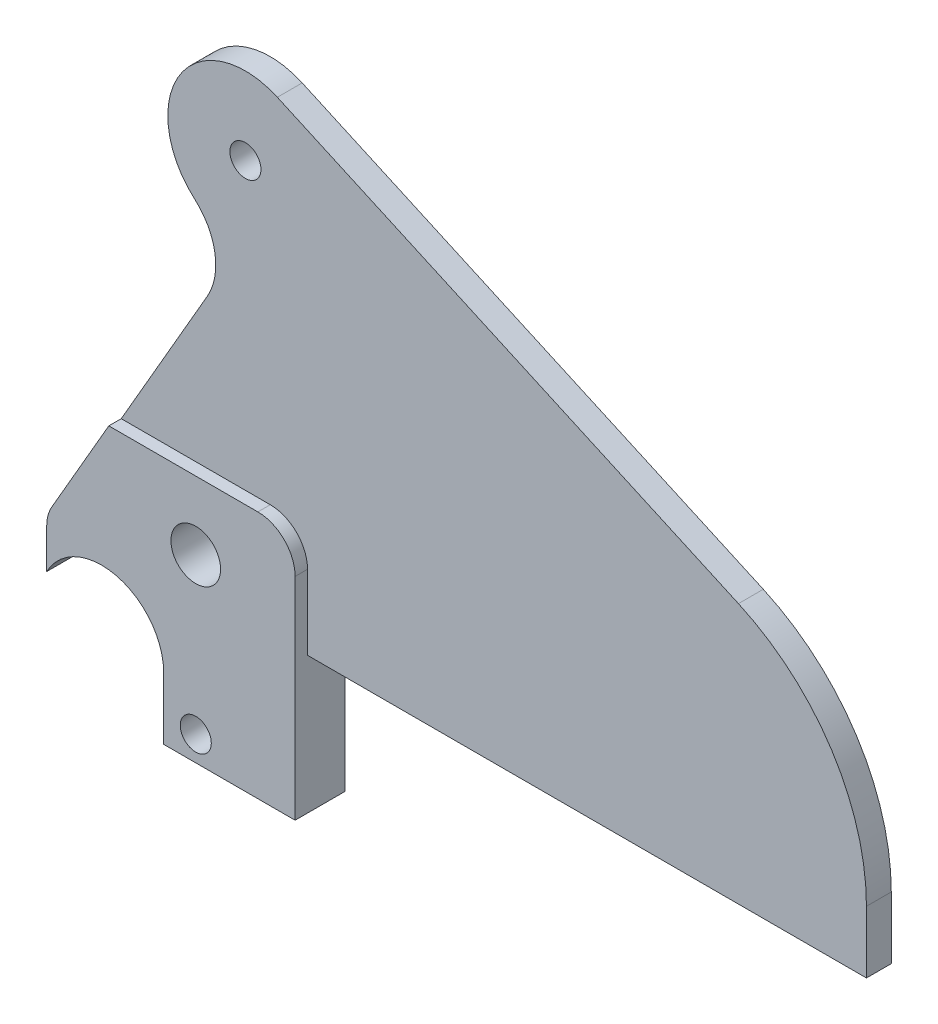
ISO-10303-21;
HEADER;
FILE_DESCRIPTION(('STEP AP214'),'2;1');
FILE_NAME('part.step','',(''),(''),'','','');
FILE_SCHEMA(('AUTOMOTIVE_DESIGN { 1 0 10303 214 1 1 1 1 }'));
ENDSEC;
DATA;
#1=APPLICATION_CONTEXT('core data for automotive mechanical design processes');
#2=APPLICATION_PROTOCOL_DEFINITION('international standard','automotive_design',2000,#1);
#3=PRODUCT_CONTEXT('',#1,'mechanical');
#4=PRODUCT('Part','Part','',(#3));
#5=PRODUCT_RELATED_PRODUCT_CATEGORY('part','',(#4));
#6=PRODUCT_DEFINITION_FORMATION('','',#4);
#7=PRODUCT_DEFINITION_CONTEXT('part definition',#1,'design');
#8=PRODUCT_DEFINITION('design','',#6,#7);
#9=PRODUCT_DEFINITION_SHAPE('','',#8);
#10=(LENGTH_UNIT() NAMED_UNIT(*) SI_UNIT(.MILLI.,.METRE.));
#11=(NAMED_UNIT(*) PLANE_ANGLE_UNIT() SI_UNIT($,.RADIAN.));
#12=(NAMED_UNIT(*) SI_UNIT($,.STERADIAN.) SOLID_ANGLE_UNIT());
#13=UNCERTAINTY_MEASURE_WITH_UNIT(LENGTH_MEASURE(1.E-05),#10,'distance_accuracy_value','');
#14=(GEOMETRIC_REPRESENTATION_CONTEXT(3) GLOBAL_UNCERTAINTY_ASSIGNED_CONTEXT((#13)) GLOBAL_UNIT_ASSIGNED_CONTEXT((#10,
#11,#12)) REPRESENTATION_CONTEXT('',''));
#15=CARTESIAN_POINT('',(0.,0.,0.));
#16=DIRECTION('',(0.,0.,1.));
#17=DIRECTION('',(1.,0.,0.));
#18=AXIS2_PLACEMENT_3D('',#15,#16,#17);
#19=CARTESIAN_POINT('',(0.,0.,1.));
#20=DIRECTION('',(0.,0.,1.));
#21=DIRECTION('',(1.,0.,0.));
#22=AXIS2_PLACEMENT_3D('',#19,#20,#21);
#23=PLANE('',#22);
#24=CARTESIAN_POINT('',(3.,41.,1.));
#25=DIRECTION('',(0.,0.,1.));
#26=DIRECTION('',(1.,0.,0.));
#27=AXIS2_PLACEMENT_3D('',#24,#25,#26);
#28=CIRCLE('',#27,1.25);
#29=CARTESIAN_POINT('',(4.25,41.,1.));
#30=VERTEX_POINT('',#29);
#31=EDGE_CURVE('E261',#30,#30,#28,.T.);
#32=ORIENTED_EDGE('',*,*,#31,.F.);
#33=EDGE_LOOP('',(#32));
#34=FACE_BOUND('',#33,.T.);
#35=DIRECTION('',(1.,0.,0.));
#36=VECTOR('',#35,1.);
#37=CARTESIAN_POINT('',(0.,18.,1.));
#38=LINE('',#37,#36);
#39=CARTESIAN_POINT('',(-7.00000000000003,18.,1.));
#40=VERTEX_POINT('',#39);
#41=CARTESIAN_POINT('',(5.,18.,1.));
#42=VERTEX_POINT('',#41);
#43=EDGE_CURVE('E238',#40,#42,#38,.T.);
#44=ORIENTED_EDGE('',*,*,#43,.T.);
#45=CARTESIAN_POINT('',(5.,15.,1.));
#46=DIRECTION('',(0.,0.,1.));
#47=DIRECTION('',(1.,0.,0.));
#48=AXIS2_PLACEMENT_3D('',#45,#46,#47);
#49=CIRCLE('',#48,3.);
#50=CARTESIAN_POINT('',(8.,15.,1.));
#51=VERTEX_POINT('',#50);
#52=EDGE_CURVE('E11',#42,#51,#49,.F.);
#53=ORIENTED_EDGE('',*,*,#52,.T.);
#54=DIRECTION('',(0.,-1.,0.));
#55=VECTOR('',#54,1.);
#56=CARTESIAN_POINT('',(8.,0.,1.));
#57=LINE('',#56,#55);
#58=CARTESIAN_POINT('',(8.,9.,1.));
#59=VERTEX_POINT('',#58);
#60=EDGE_CURVE('E241',#51,#59,#57,.T.);
#61=ORIENTED_EDGE('',*,*,#60,.T.);
#62=DIRECTION('',(1.,0.,0.));
#63=VECTOR('',#62,1.);
#64=CARTESIAN_POINT('',(0.,9.,1.));
#65=LINE('',#64,#63);
#66=CARTESIAN_POINT('',(53.,9.,1.));
#67=VERTEX_POINT('',#66);
#68=EDGE_CURVE('E244',#59,#67,#65,.T.);
#69=ORIENTED_EDGE('',*,*,#68,.T.);
#70=DIRECTION('',(0.,1.,0.));
#71=VECTOR('',#70,1.);
#72=CARTESIAN_POINT('',(53.,0.,1.));
#73=LINE('',#72,#71);
#74=CARTESIAN_POINT('',(53.,14.,1.));
#75=VERTEX_POINT('',#74);
#76=EDGE_CURVE('E246',#67,#75,#73,.T.);
#77=ORIENTED_EDGE('',*,*,#76,.T.);
#78=CARTESIAN_POINT('',(35.5,14.,1.));
#79=DIRECTION('',(0.,0.,1.));
#80=DIRECTION('',(1.,0.,0.));
#81=AXIS2_PLACEMENT_3D('',#78,#79,#80);
#82=CIRCLE('',#81,17.5);
#83=CARTESIAN_POINT('',(42.695106585047,29.9524431116307,1.));
#84=VERTEX_POINT('',#83);
#85=EDGE_CURVE('E249',#75,#84,#82,.T.);
#86=ORIENTED_EDGE('',*,*,#85,.T.);
#87=DIRECTION('',(0.911568177807467,-0.411148947716973,0.));
#88=VECTOR('',#87,1.);
#89=CARTESIAN_POINT('',(18.4432134750479,40.8908902569704,1.));
#90=LINE('',#89,#88);
#91=CARTESIAN_POINT('',(5.56968092323107,46.6973011112967,1.));
#92=VERTEX_POINT('',#91);
#93=EDGE_CURVE('E251',#92,#84,#90,.T.);
#94=ORIENTED_EDGE('',*,*,#93,.F.);
#95=CARTESIAN_POINT('',(3.,41.,1.));
#96=DIRECTION('',(0.,0.,1.));
#97=DIRECTION('',(1.,0.,0.));
#98=AXIS2_PLACEMENT_3D('',#95,#96,#97);
#99=CIRCLE('',#98,6.24999999999999);
#100=CARTESIAN_POINT('',(-1.10619804468567,36.288138624936,1.));
#101=VERTEX_POINT('',#100);
#102=EDGE_CURVE('E254',#92,#101,#99,.T.);
#103=ORIENTED_EDGE('',*,*,#102,.T.);
#104=CARTESIAN_POINT('',(-4.3911564804342,32.5186495248849,1.));
#105=DIRECTION('',(0.,0.,1.));
#106=DIRECTION('',(1.,0.,0.));
#107=AXIS2_PLACEMENT_3D('',#104,#105,#106);
#108=CIRCLE('',#107,5.);
#109=CARTESIAN_POINT('',(-0.0610294615120115,30.0186495248849,1.));
#110=VERTEX_POINT('',#109);
#111=EDGE_CURVE('E256',#110,#101,#108,.T.);
#112=ORIENTED_EDGE('',*,*,#111,.F.);
#113=DIRECTION('',(-0.499999999999998,-0.86602540378444,0.));
#114=VECTOR('',#113,1.);
#115=CARTESIAN_POINT('',(-13.04422863406,7.53108891324549,1.));
#116=LINE('',#115,#114);
#117=EDGE_CURVE('E259',#110,#40,#116,.T.);
#118=ORIENTED_EDGE('',*,*,#117,.T.);
#119=EDGE_LOOP('',(#44,#53,#61,#69,#77,#86,#94,#103,#112,#118));
#120=FACE_BOUND('',#119,.T.);
#121=ADVANCED_FACE('F39',(#34,#120),#23,.T.);
#122=CARTESIAN_POINT('',(0.,0.,-1.));
#123=DIRECTION('',(0.,0.,1.));
#124=DIRECTION('',(1.,0.,0.));
#125=AXIS2_PLACEMENT_3D('',#122,#123,#124);
#126=PLANE('',#125);
#127=CARTESIAN_POINT('',(3.,41.,-1.));
#128=DIRECTION('',(0.,0.,1.));
#129=DIRECTION('',(1.,0.,0.));
#130=AXIS2_PLACEMENT_3D('',#127,#128,#129);
#131=CIRCLE('',#130,1.25);
#132=CARTESIAN_POINT('',(4.25,41.,-1.));
#133=VERTEX_POINT('',#132);
#134=EDGE_CURVE('E247',#133,#133,#131,.T.);
#135=ORIENTED_EDGE('',*,*,#134,.T.);
#136=EDGE_LOOP('',(#135));
#137=FACE_BOUND('',#136,.T.);
#138=DIRECTION('',(0.,-1.,0.));
#139=VECTOR('',#138,1.);
#140=CARTESIAN_POINT('',(8.,0.,-1.));
#141=LINE('',#140,#139);
#142=CARTESIAN_POINT('',(8.,15.,-1.));
#143=VERTEX_POINT('',#142);
#144=CARTESIAN_POINT('',(8.,9.,-1.));
#145=VERTEX_POINT('',#144);
#146=EDGE_CURVE('E308',#143,#145,#141,.T.);
#147=ORIENTED_EDGE('',*,*,#146,.F.);
#148=CARTESIAN_POINT('',(5.,15.,-1.));
#149=DIRECTION('',(0.,0.,1.));
#150=DIRECTION('',(1.,0.,0.));
#151=AXIS2_PLACEMENT_3D('',#148,#149,#150);
#152=CIRCLE('',#151,3.);
#153=CARTESIAN_POINT('',(5.,18.,-1.));
#154=VERTEX_POINT('',#153);
#155=EDGE_CURVE('E47',#143,#154,#152,.T.);
#156=ORIENTED_EDGE('',*,*,#155,.T.);
#157=DIRECTION('',(1.,0.,0.));
#158=VECTOR('',#157,1.);
#159=CARTESIAN_POINT('',(0.,18.,-1.));
#160=LINE('',#159,#158);
#161=CARTESIAN_POINT('',(-7.00000000000002,18.,-1.));
#162=VERTEX_POINT('',#161);
#163=EDGE_CURVE('E182',#162,#154,#160,.T.);
#164=ORIENTED_EDGE('',*,*,#163,.F.);
#165=DIRECTION('',(-0.499999999999998,-0.86602540378444,0.));
#166=VECTOR('',#165,1.);
#167=CARTESIAN_POINT('',(-13.04422863406,7.53108891324549,-1.));
#168=LINE('',#167,#166);
#169=CARTESIAN_POINT('',(-0.0610294615120115,30.0186495248849,-1.));
#170=VERTEX_POINT('',#169);
#171=EDGE_CURVE('E280',#170,#162,#168,.T.);
#172=ORIENTED_EDGE('',*,*,#171,.F.);
#173=CARTESIAN_POINT('',(-4.3911564804342,32.5186495248849,-1.));
#174=DIRECTION('',(0.,0.,1.));
#175=DIRECTION('',(1.,0.,0.));
#176=AXIS2_PLACEMENT_3D('',#173,#174,#175);
#177=CIRCLE('',#176,5.);
#178=CARTESIAN_POINT('',(-1.10619804468567,36.288138624936,-1.));
#179=VERTEX_POINT('',#178);
#180=EDGE_CURVE('E277',#170,#179,#177,.T.);
#181=ORIENTED_EDGE('',*,*,#180,.T.);
#182=CARTESIAN_POINT('',(3.,41.,-1.));
#183=DIRECTION('',(0.,0.,1.));
#184=DIRECTION('',(1.,0.,0.));
#185=AXIS2_PLACEMENT_3D('',#182,#183,#184);
#186=CIRCLE('',#185,6.24999999999999);
#187=CARTESIAN_POINT('',(5.56968092323107,46.6973011112967,-1.));
#188=VERTEX_POINT('',#187);
#189=EDGE_CURVE('E274',#188,#179,#186,.T.);
#190=ORIENTED_EDGE('',*,*,#189,.F.);
#191=DIRECTION('',(0.911568177807467,-0.411148947716973,0.));
#192=VECTOR('',#191,1.);
#193=CARTESIAN_POINT('',(18.4432134750479,40.8908902569704,-1.));
#194=LINE('',#193,#192);
#195=CARTESIAN_POINT('',(42.695106585047,29.9524431116307,-1.));
#196=VERTEX_POINT('',#195);
#197=EDGE_CURVE('E271',#188,#196,#194,.T.);
#198=ORIENTED_EDGE('',*,*,#197,.T.);
#199=CARTESIAN_POINT('',(35.5,14.,-1.));
#200=DIRECTION('',(0.,0.,1.));
#201=DIRECTION('',(1.,0.,0.));
#202=AXIS2_PLACEMENT_3D('',#199,#200,#201);
#203=CIRCLE('',#202,17.5);
#204=CARTESIAN_POINT('',(53.,14.,-1.));
#205=VERTEX_POINT('',#204);
#206=EDGE_CURVE('E268',#205,#196,#203,.T.);
#207=ORIENTED_EDGE('',*,*,#206,.F.);
#208=DIRECTION('',(0.,1.,0.));
#209=VECTOR('',#208,1.);
#210=CARTESIAN_POINT('',(53.,0.,-1.));
#211=LINE('',#210,#209);
#212=CARTESIAN_POINT('',(53.,9.,-1.));
#213=VERTEX_POINT('',#212);
#214=EDGE_CURVE('E266',#213,#205,#211,.T.);
#215=ORIENTED_EDGE('',*,*,#214,.F.);
#216=DIRECTION('',(1.,0.,0.));
#217=VECTOR('',#216,1.);
#218=CARTESIAN_POINT('',(0.,9.,-1.));
#219=LINE('',#218,#217);
#220=EDGE_CURVE('E243',#145,#213,#219,.T.);
#221=ORIENTED_EDGE('',*,*,#220,.F.);
#222=EDGE_LOOP('',(#147,#156,#164,#172,#181,#190,#198,#207,#215,#221));
#223=FACE_BOUND('',#222,.T.);
#224=ADVANCED_FACE('F334',(#137,#223),#126,.F.);
#225=CARTESIAN_POINT('',(-7.58122315198238,2.99999999999999,1.));
#226=DIRECTION('',(0.,0.,-1.));
#227=DIRECTION('',(-1.,0.,0.));
#228=AXIS2_PLACEMENT_3D('',#225,#226,#227);
#229=CYLINDRICAL_SURFACE('',#228,5.);
#230=DIRECTION('',(0.,0.,-1.));
#231=VECTOR('',#230,1.);
#232=CARTESIAN_POINT('',(-12.,5.3397459621556,1.));
#233=LINE('',#232,#231);
#234=CARTESIAN_POINT('',(-12.,5.3397459621556,2.));
#235=VERTEX_POINT('',#234);
#236=CARTESIAN_POINT('',(-12.,5.3397459621556,-2.));
#237=VERTEX_POINT('',#236);
#238=EDGE_CURVE('E264',#235,#237,#233,.T.);
#239=ORIENTED_EDGE('',*,*,#238,.T.);
#240=CARTESIAN_POINT('',(-7.58122315198238,2.99999999999999,-2.));
#241=DIRECTION('',(0.,0.,1.));
#242=DIRECTION('',(1.,0.,0.));
#243=AXIS2_PLACEMENT_3D('',#240,#241,#242);
#244=CIRCLE('',#243,5.);
#245=CARTESIAN_POINT('',(-2.58122315198237,2.99999999999999,-2.));
#246=VERTEX_POINT('',#245);
#247=EDGE_CURVE('E178',#246,#237,#244,.T.);
#248=ORIENTED_EDGE('',*,*,#247,.F.);
#249=DIRECTION('',(0.,0.,-1.));
#250=VECTOR('',#249,1.);
#251=CARTESIAN_POINT('',(-2.58122315198237,2.99999999999999,1.));
#252=LINE('',#251,#250);
#253=CARTESIAN_POINT('',(-2.58122315198237,2.99999999999999,2.));
#254=VERTEX_POINT('',#253);
#255=EDGE_CURVE('E171',#254,#246,#252,.T.);
#256=ORIENTED_EDGE('',*,*,#255,.F.);
#257=CARTESIAN_POINT('',(-7.58122315198238,2.99999999999999,2.));
#258=DIRECTION('',(0.,0.,1.));
#259=DIRECTION('',(1.,0.,0.));
#260=AXIS2_PLACEMENT_3D('',#257,#258,#259);
#261=CIRCLE('',#260,5.);
#262=EDGE_CURVE('E176',#254,#235,#261,.T.);
#263=ORIENTED_EDGE('',*,*,#262,.T.);
#264=EDGE_LOOP('',(#239,#248,#256,#263));
#265=FACE_BOUND('',#264,.T.);
#266=ADVANCED_FACE('F174',(#265),#229,.F.);
#267=CARTESIAN_POINT('',(-2.58122315198237,0.,1.));
#268=DIRECTION('',(1.,0.,0.));
#269=DIRECTION('',(0.,1.,0.));
#270=AXIS2_PLACEMENT_3D('',#267,#268,#269);
#271=PLANE('',#270);
#272=ORIENTED_EDGE('',*,*,#255,.T.);
#273=DIRECTION('',(0.,-1.,0.));
#274=VECTOR('',#273,1.);
#275=CARTESIAN_POINT('',(-2.58122315198237,0.,-2.));
#276=LINE('',#275,#274);
#277=CARTESIAN_POINT('',(-2.58122315198237,-2.00000000000001,-2.));
#278=VERTEX_POINT('',#277);
#279=EDGE_CURVE('E219',#246,#278,#276,.T.);
#280=ORIENTED_EDGE('',*,*,#279,.T.);
#281=DIRECTION('',(0.,0.,-1.));
#282=VECTOR('',#281,1.);
#283=CARTESIAN_POINT('',(-2.58122315198237,-2.00000000000001,1.));
#284=LINE('',#283,#282);
#285=CARTESIAN_POINT('',(-2.58122315198237,-2.00000000000001,2.));
#286=VERTEX_POINT('',#285);
#287=EDGE_CURVE('E183',#286,#278,#284,.T.);
#288=ORIENTED_EDGE('',*,*,#287,.F.);
#289=DIRECTION('',(0.,-1.,0.));
#290=VECTOR('',#289,1.);
#291=CARTESIAN_POINT('',(-2.58122315198237,0.,2.));
#292=LINE('',#291,#290);
#293=EDGE_CURVE('E186',#254,#286,#292,.T.);
#294=ORIENTED_EDGE('',*,*,#293,.F.);
#295=EDGE_LOOP('',(#272,#280,#288,#294));
#296=FACE_BOUND('',#295,.T.);
#297=ADVANCED_FACE('F187',(#296),#271,.F.);
#298=CARTESIAN_POINT('',(0.,-2.,1.));
#299=DIRECTION('',(0.,1.,0.));
#300=DIRECTION('',(-1.,0.,0.));
#301=AXIS2_PLACEMENT_3D('',#298,#299,#300);
#302=PLANE('',#301);
#303=ORIENTED_EDGE('',*,*,#287,.T.);
#304=DIRECTION('',(1.,0.,0.));
#305=VECTOR('',#304,1.);
#306=CARTESIAN_POINT('',(0.,-2.,-2.));
#307=LINE('',#306,#305);
#308=CARTESIAN_POINT('',(8.,-2.,-2.));
#309=VERTEX_POINT('',#308);
#310=EDGE_CURVE('E221',#278,#309,#307,.T.);
#311=ORIENTED_EDGE('',*,*,#310,.T.);
#312=DIRECTION('',(0.,0.,-1.));
#313=VECTOR('',#312,1.);
#314=CARTESIAN_POINT('',(8.,-2.,1.));
#315=LINE('',#314,#313);
#316=CARTESIAN_POINT('',(8.,-2.,2.));
#317=VERTEX_POINT('',#316);
#318=EDGE_CURVE('E303',#317,#309,#315,.T.);
#319=ORIENTED_EDGE('',*,*,#318,.F.);
#320=DIRECTION('',(1.,0.,0.));
#321=VECTOR('',#320,1.);
#322=CARTESIAN_POINT('',(0.,-2.,2.));
#323=LINE('',#322,#321);
#324=EDGE_CURVE('E190',#286,#317,#323,.T.);
#325=ORIENTED_EDGE('',*,*,#324,.F.);
#326=EDGE_LOOP('',(#303,#311,#319,#325));
#327=FACE_BOUND('',#326,.T.);
#328=ADVANCED_FACE('F355',(#327),#302,.F.);
#329=CARTESIAN_POINT('',(8.,0.,1.));
#330=DIRECTION('',(-1.,0.,0.));
#331=DIRECTION('',(0.,0.,1.));
#332=AXIS2_PLACEMENT_3D('',#329,#330,#331);
#333=PLANE('',#332);
#334=DIRECTION('',(0.,1.,0.));
#335=VECTOR('',#334,1.);
#336=CARTESIAN_POINT('',(8.,0.,-2.));
#337=LINE('',#336,#335);
#338=CARTESIAN_POINT('',(8.,15.,-2.));
#339=VERTEX_POINT('',#338);
#340=EDGE_CURVE('E224',#309,#339,#337,.T.);
#341=ORIENTED_EDGE('',*,*,#340,.T.);
#342=DIRECTION('',(0.,0.,-1.));
#343=VECTOR('',#342,1.);
#344=CARTESIAN_POINT('',(8.,15.,1.));
#345=LINE('',#344,#343);
#346=EDGE_CURVE('E319',#339,#143,#345,.F.);
#347=ORIENTED_EDGE('',*,*,#346,.T.);
#348=ORIENTED_EDGE('',*,*,#146,.T.);
#349=DIRECTION('',(0.,0.,-1.));
#350=VECTOR('',#349,1.);
#351=CARTESIAN_POINT('',(8.,9.,1.));
#352=LINE('',#351,#350);
#353=EDGE_CURVE('E300',#59,#145,#352,.T.);
#354=ORIENTED_EDGE('',*,*,#353,.F.);
#355=ORIENTED_EDGE('',*,*,#60,.F.);
#356=DIRECTION('',(0.,0.,-1.));
#357=VECTOR('',#356,1.);
#358=CARTESIAN_POINT('',(8.,15.,1.));
#359=LINE('',#358,#357);
#360=CARTESIAN_POINT('',(8.,15.,2.));
#361=VERTEX_POINT('',#360);
#362=EDGE_CURVE('E317',#51,#361,#359,.F.);
#363=ORIENTED_EDGE('',*,*,#362,.T.);
#364=DIRECTION('',(0.,1.,0.));
#365=VECTOR('',#364,1.);
#366=CARTESIAN_POINT('',(8.,0.,2.));
#367=LINE('',#366,#365);
#368=EDGE_CURVE('E204',#317,#361,#367,.T.);
#369=ORIENTED_EDGE('',*,*,#368,.F.);
#370=ORIENTED_EDGE('',*,*,#318,.T.);
#371=EDGE_LOOP('',(#341,#347,#348,#354,#355,#363,#369,#370));
#372=FACE_BOUND('',#371,.T.);
#373=ADVANCED_FACE('F352',(#372),#333,.F.);
#374=CARTESIAN_POINT('',(0.,9.,1.));
#375=DIRECTION('',(0.,1.,0.));
#376=DIRECTION('',(0.,0.,1.));
#377=AXIS2_PLACEMENT_3D('',#374,#375,#376);
#378=PLANE('',#377);
#379=ORIENTED_EDGE('',*,*,#220,.T.);
#380=DIRECTION('',(0.,0.,-1.));
#381=VECTOR('',#380,1.);
#382=CARTESIAN_POINT('',(53.,9.,1.));
#383=LINE('',#382,#381);
#384=EDGE_CURVE('E297',#67,#213,#383,.T.);
#385=ORIENTED_EDGE('',*,*,#384,.F.);
#386=ORIENTED_EDGE('',*,*,#68,.F.);
#387=ORIENTED_EDGE('',*,*,#353,.T.);
#388=EDGE_LOOP('',(#379,#385,#386,#387));
#389=FACE_BOUND('',#388,.T.);
#390=ADVANCED_FACE('F417',(#389),#378,.F.);
#391=CARTESIAN_POINT('',(53.,0.,1.));
#392=DIRECTION('',(-1.,0.,0.));
#393=DIRECTION('',(0.,0.,1.));
#394=AXIS2_PLACEMENT_3D('',#391,#392,#393);
#395=PLANE('',#394);
#396=ORIENTED_EDGE('',*,*,#214,.T.);
#397=DIRECTION('',(0.,0.,-1.));
#398=VECTOR('',#397,1.);
#399=CARTESIAN_POINT('',(53.,14.,1.));
#400=LINE('',#399,#398);
#401=EDGE_CURVE('E294',#75,#205,#400,.T.);
#402=ORIENTED_EDGE('',*,*,#401,.F.);
#403=ORIENTED_EDGE('',*,*,#76,.F.);
#404=ORIENTED_EDGE('',*,*,#384,.T.);
#405=EDGE_LOOP('',(#396,#402,#403,#404));
#406=FACE_BOUND('',#405,.T.);
#407=ADVANCED_FACE('F413',(#406),#395,.F.);
#408=CARTESIAN_POINT('',(35.5,14.,1.));
#409=DIRECTION('',(0.,0.,-1.));
#410=DIRECTION('',(-1.,0.,0.));
#411=AXIS2_PLACEMENT_3D('',#408,#409,#410);
#412=CYLINDRICAL_SURFACE('',#411,17.5);
#413=ORIENTED_EDGE('',*,*,#206,.T.);
#414=DIRECTION('',(0.,0.,-1.));
#415=VECTOR('',#414,1.);
#416=CARTESIAN_POINT('',(42.695106585047,29.9524431116307,1.));
#417=LINE('',#416,#415);
#418=EDGE_CURVE('E292',#84,#196,#417,.T.);
#419=ORIENTED_EDGE('',*,*,#418,.F.);
#420=ORIENTED_EDGE('',*,*,#85,.F.);
#421=ORIENTED_EDGE('',*,*,#401,.T.);
#422=EDGE_LOOP('',(#413,#419,#420,#421));
#423=FACE_BOUND('',#422,.T.);
#424=ADVANCED_FACE('F409',(#423),#412,.T.);
#425=CARTESIAN_POINT('',(18.4432134750479,40.8908902569704,1.));
#426=DIRECTION('',(0.411148947716973,0.911568177807467,0.));
#427=DIRECTION('',(-0.911568177807467,0.411148947716973,0.));
#428=AXIS2_PLACEMENT_3D('',#425,#426,#427);
#429=PLANE('',#428);
#430=ORIENTED_EDGE('',*,*,#197,.F.);
#431=DIRECTION('',(0.,0.,-1.));
#432=VECTOR('',#431,1.);
#433=CARTESIAN_POINT('',(5.56968092323107,46.6973011112967,1.));
#434=LINE('',#433,#432);
#435=EDGE_CURVE('E290',#92,#188,#434,.T.);
#436=ORIENTED_EDGE('',*,*,#435,.F.);
#437=ORIENTED_EDGE('',*,*,#93,.T.);
#438=ORIENTED_EDGE('',*,*,#418,.T.);
#439=EDGE_LOOP('',(#430,#436,#437,#438));
#440=FACE_BOUND('',#439,.T.);
#441=ADVANCED_FACE('F405',(#440),#429,.T.);
#442=CARTESIAN_POINT('',(3.,41.,1.));
#443=DIRECTION('',(0.,0.,-1.));
#444=DIRECTION('',(-1.,0.,0.));
#445=AXIS2_PLACEMENT_3D('',#442,#443,#444);
#446=CYLINDRICAL_SURFACE('',#445,6.24999999999999);
#447=ORIENTED_EDGE('',*,*,#189,.T.);
#448=DIRECTION('',(0.,0.,-1.));
#449=VECTOR('',#448,1.);
#450=CARTESIAN_POINT('',(-1.10619804468567,36.288138624936,1.));
#451=LINE('',#450,#449);
#452=EDGE_CURVE('E288',#101,#179,#451,.T.);
#453=ORIENTED_EDGE('',*,*,#452,.F.);
#454=ORIENTED_EDGE('',*,*,#102,.F.);
#455=ORIENTED_EDGE('',*,*,#435,.T.);
#456=EDGE_LOOP('',(#447,#453,#454,#455));
#457=FACE_BOUND('',#456,.T.);
#458=ADVANCED_FACE('F401',(#457),#446,.T.);
#459=CARTESIAN_POINT('',(-4.3911564804342,32.5186495248849,1.));
#460=DIRECTION('',(0.,0.,-1.));
#461=DIRECTION('',(-1.,0.,0.));
#462=AXIS2_PLACEMENT_3D('',#459,#460,#461);
#463=CYLINDRICAL_SURFACE('',#462,5.);
#464=ORIENTED_EDGE('',*,*,#180,.F.);
#465=DIRECTION('',(0.,0.,-1.));
#466=VECTOR('',#465,1.);
#467=CARTESIAN_POINT('',(-0.0610294615120115,30.0186495248849,1.));
#468=LINE('',#467,#466);
#469=EDGE_CURVE('E286',#110,#170,#468,.T.);
#470=ORIENTED_EDGE('',*,*,#469,.F.);
#471=ORIENTED_EDGE('',*,*,#111,.T.);
#472=ORIENTED_EDGE('',*,*,#452,.T.);
#473=EDGE_LOOP('',(#464,#470,#471,#472));
#474=FACE_BOUND('',#473,.T.);
#475=ADVANCED_FACE('F398',(#474),#463,.F.);
#476=CARTESIAN_POINT('',(-13.04422863406,7.53108891324549,1.));
#477=DIRECTION('',(0.86602540378444,-0.499999999999998,0.));
#478=DIRECTION('',(0.499999999999998,0.86602540378444,0.));
#479=AXIS2_PLACEMENT_3D('',#476,#477,#478);
#480=PLANE('',#479);
#481=DIRECTION('',(-0.499999999999998,-0.86602540378444,0.));
#482=VECTOR('',#481,1.);
#483=CARTESIAN_POINT('',(-13.04422863406,7.53108891324549,-2.));
#484=LINE('',#483,#482);
#485=CARTESIAN_POINT('',(-7.00000000000002,18.,-2.));
#486=VERTEX_POINT('',#485);
#487=CARTESIAN_POINT('',(-11.5980762113533,10.0358983848622,-2.));
#488=VERTEX_POINT('',#487);
#489=EDGE_CURVE('E229',#486,#488,#484,.T.);
#490=ORIENTED_EDGE('',*,*,#489,.T.);
#491=DIRECTION('',(0.,0.,-1.));
#492=VECTOR('',#491,1.);
#493=CARTESIAN_POINT('',(-11.5980762113533,10.0358983848622,1.));
#494=LINE('',#493,#492);
#495=CARTESIAN_POINT('',(-11.5980762113533,10.0358983848622,2.));
#496=VERTEX_POINT('',#495);
#497=EDGE_CURVE('E62',#488,#496,#494,.F.);
#498=ORIENTED_EDGE('',*,*,#497,.T.);
#499=DIRECTION('',(-0.499999999999998,-0.86602540378444,0.));
#500=VECTOR('',#499,1.);
#501=CARTESIAN_POINT('',(-13.04422863406,7.53108891324549,2.));
#502=LINE('',#501,#500);
#503=CARTESIAN_POINT('',(-7.00000000000002,18.,2.));
#504=VERTEX_POINT('',#503);
#505=EDGE_CURVE('E208',#504,#496,#502,.T.);
#506=ORIENTED_EDGE('',*,*,#505,.F.);
#507=DIRECTION('',(0.,0.,-1.));
#508=VECTOR('',#507,1.);
#509=CARTESIAN_POINT('',(-7.00000000000002,18.,2.));
#510=LINE('',#509,#508);
#511=EDGE_CURVE('E235',#504,#40,#510,.T.);
#512=ORIENTED_EDGE('',*,*,#511,.T.);
#513=ORIENTED_EDGE('',*,*,#117,.F.);
#514=ORIENTED_EDGE('',*,*,#469,.T.);
#515=ORIENTED_EDGE('',*,*,#171,.T.);
#516=EDGE_CURVE('E217',#162,#486,#510,.T.);
#517=ORIENTED_EDGE('',*,*,#516,.T.);
#518=EDGE_LOOP('',(#490,#498,#506,#512,#513,#514,#515,#517));
#519=FACE_BOUND('',#518,.T.);
#520=ADVANCED_FACE('F395',(#519),#480,.F.);
#521=CARTESIAN_POINT('',(-12.,0.,1.));
#522=DIRECTION('',(1.,0.,0.));
#523=DIRECTION('',(0.,1.,0.));
#524=AXIS2_PLACEMENT_3D('',#521,#522,#523);
#525=PLANE('',#524);
#526=DIRECTION('',(0.,-1.,0.));
#527=VECTOR('',#526,1.);
#528=CARTESIAN_POINT('',(-12.,0.,2.));
#529=LINE('',#528,#527);
#530=CARTESIAN_POINT('',(-12.,8.53589838486224,2.));
#531=VERTEX_POINT('',#530);
#532=EDGE_CURVE('E195',#531,#235,#529,.T.);
#533=ORIENTED_EDGE('',*,*,#532,.F.);
#534=DIRECTION('',(0.,0.,-1.));
#535=VECTOR('',#534,1.);
#536=CARTESIAN_POINT('',(-12.,8.53589838486224,1.));
#537=LINE('',#536,#535);
#538=CARTESIAN_POINT('',(-12.,8.53589838486224,-2.));
#539=VERTEX_POINT('',#538);
#540=EDGE_CURVE('E327',#531,#539,#537,.T.);
#541=ORIENTED_EDGE('',*,*,#540,.T.);
#542=DIRECTION('',(0.,-1.,0.));
#543=VECTOR('',#542,1.);
#544=CARTESIAN_POINT('',(-12.,0.,-2.));
#545=LINE('',#544,#543);
#546=EDGE_CURVE('E231',#539,#237,#545,.T.);
#547=ORIENTED_EDGE('',*,*,#546,.T.);
#548=ORIENTED_EDGE('',*,*,#238,.F.);
#549=EDGE_LOOP('',(#533,#541,#547,#548));
#550=FACE_BOUND('',#549,.T.);
#551=ADVANCED_FACE('F358',(#550),#525,.F.);
#552=CARTESIAN_POINT('',(3.,41.,1.));
#553=DIRECTION('',(0.,0.,-1.));
#554=DIRECTION('',(-1.,0.,0.));
#555=AXIS2_PLACEMENT_3D('',#552,#553,#554);
#556=CYLINDRICAL_SURFACE('',#555,1.25);
#557=ORIENTED_EDGE('',*,*,#31,.T.);
#558=EDGE_LOOP('',(#557));
#559=FACE_BOUND('',#558,.T.);
#560=ORIENTED_EDGE('',*,*,#134,.F.);
#561=EDGE_LOOP('',(#560));
#562=FACE_BOUND('',#561,.T.);
#563=ADVANCED_FACE('F381',(#559,#562),#556,.F.);
#564=CARTESIAN_POINT('',(0.,18.,2.));
#565=DIRECTION('',(0.,-1.,0.));
#566=DIRECTION('',(0.,0.,-1.));
#567=AXIS2_PLACEMENT_3D('',#564,#565,#566);
#568=PLANE('',#567);
#569=ORIENTED_EDGE('',*,*,#163,.T.);
#570=DIRECTION('',(0.,0.,-1.));
#571=VECTOR('',#570,1.);
#572=CARTESIAN_POINT('',(5.,18.,2.));
#573=LINE('',#572,#571);
#574=CARTESIAN_POINT('',(5.,18.,-2.));
#575=VERTEX_POINT('',#574);
#576=EDGE_CURVE('E310',#154,#575,#573,.T.);
#577=ORIENTED_EDGE('',*,*,#576,.T.);
#578=DIRECTION('',(-1.,0.,0.));
#579=VECTOR('',#578,1.);
#580=CARTESIAN_POINT('',(0.,18.,-2.));
#581=LINE('',#580,#579);
#582=EDGE_CURVE('E227',#575,#486,#581,.T.);
#583=ORIENTED_EDGE('',*,*,#582,.T.);
#584=ORIENTED_EDGE('',*,*,#516,.F.);
#585=EDGE_LOOP('',(#569,#577,#583,#584));
#586=FACE_BOUND('',#585,.T.);
#587=ADVANCED_FACE('F341',(#586),#568,.F.);
#588=CARTESIAN_POINT('',(0.,0.,-2.));
#589=DIRECTION('',(0.,0.,1.));
#590=DIRECTION('',(1.,0.,0.));
#591=AXIS2_PLACEMENT_3D('',#588,#589,#590);
#592=PLANE('',#591);
#593=ORIENTED_EDGE('',*,*,#582,.F.);
#594=CARTESIAN_POINT('',(5.,15.,-2.));
#595=DIRECTION('',(0.,0.,1.));
#596=DIRECTION('',(1.,0.,0.));
#597=AXIS2_PLACEMENT_3D('',#594,#595,#596);
#598=CIRCLE('',#597,3.);
#599=EDGE_CURVE('E315',#575,#339,#598,.F.);
#600=ORIENTED_EDGE('',*,*,#599,.T.);
#601=ORIENTED_EDGE('',*,*,#340,.F.);
#602=ORIENTED_EDGE('',*,*,#310,.F.);
#603=ORIENTED_EDGE('',*,*,#279,.F.);
#604=ORIENTED_EDGE('',*,*,#247,.T.);
#605=ORIENTED_EDGE('',*,*,#546,.F.);
#606=CARTESIAN_POINT('',(-9.,8.53589838486223,-2.));
#607=DIRECTION('',(0.,0.,1.));
#608=DIRECTION('',(1.,0.,0.));
#609=AXIS2_PLACEMENT_3D('',#606,#607,#608);
#610=CIRCLE('',#609,3.);
#611=EDGE_CURVE('E313',#539,#488,#610,.F.);
#612=ORIENTED_EDGE('',*,*,#611,.T.);
#613=ORIENTED_EDGE('',*,*,#489,.F.);
#614=EDGE_LOOP('',(#593,#600,#601,#602,#603,#604,#605,#612,#613));
#615=FACE_BOUND('',#614,.T.);
#616=CARTESIAN_POINT('',(0.,12.5,-2.));
#617=DIRECTION('',(0.,0.,1.));
#618=DIRECTION('',(1.,0.,0.));
#619=AXIS2_PLACEMENT_3D('',#616,#617,#618);
#620=CIRCLE('',#619,2.);
#621=CARTESIAN_POINT('',(2.,12.5,-2.));
#622=VERTEX_POINT('',#621);
#623=EDGE_CURVE('E200',#622,#622,#620,.T.);
#624=ORIENTED_EDGE('',*,*,#623,.T.);
#625=EDGE_LOOP('',(#624));
#626=FACE_BOUND('',#625,.T.);
#627=CARTESIAN_POINT('',(0.,0.,-2.));
#628=DIRECTION('',(0.,0.,1.));
#629=DIRECTION('',(1.,0.,0.));
#630=AXIS2_PLACEMENT_3D('',#627,#628,#629);
#631=CIRCLE('',#630,1.25);
#632=CARTESIAN_POINT('',(1.25,0.,-2.));
#633=VERTEX_POINT('',#632);
#634=EDGE_CURVE('E197',#633,#633,#631,.T.);
#635=ORIENTED_EDGE('',*,*,#634,.T.);
#636=EDGE_LOOP('',(#635));
#637=FACE_BOUND('',#636,.T.);
#638=ADVANCED_FACE('F347',(#615,#626,#637),#592,.F.);
#639=CARTESIAN_POINT('',(0.,0.,1.));
#640=DIRECTION('',(0.,0.,-1.));
#641=DIRECTION('',(-1.,0.,0.));
#642=AXIS2_PLACEMENT_3D('',#639,#640,#641);
#643=CYLINDRICAL_SURFACE('',#642,1.25);
#644=ORIENTED_EDGE('',*,*,#634,.F.);
#645=EDGE_LOOP('',(#644));
#646=FACE_BOUND('',#645,.T.);
#647=CARTESIAN_POINT('',(0.,0.,2.));
#648=DIRECTION('',(0.,0.,1.));
#649=DIRECTION('',(1.,0.,0.));
#650=AXIS2_PLACEMENT_3D('',#647,#648,#649);
#651=CIRCLE('',#650,1.25);
#652=CARTESIAN_POINT('',(1.25,0.,2.));
#653=VERTEX_POINT('',#652);
#654=EDGE_CURVE('E214',#653,#653,#651,.T.);
#655=ORIENTED_EDGE('',*,*,#654,.T.);
#656=EDGE_LOOP('',(#655));
#657=FACE_BOUND('',#656,.T.);
#658=ADVANCED_FACE('F385',(#646,#657),#643,.F.);
#659=CARTESIAN_POINT('',(0.,12.5,1.));
#660=DIRECTION('',(0.,0.,-1.));
#661=DIRECTION('',(-1.,0.,0.));
#662=AXIS2_PLACEMENT_3D('',#659,#660,#661);
#663=CYLINDRICAL_SURFACE('',#662,2.);
#664=ORIENTED_EDGE('',*,*,#623,.F.);
#665=EDGE_LOOP('',(#664));
#666=FACE_BOUND('',#665,.T.);
#667=CARTESIAN_POINT('',(0.,12.5,2.));
#668=DIRECTION('',(0.,0.,1.));
#669=DIRECTION('',(1.,0.,0.));
#670=AXIS2_PLACEMENT_3D('',#667,#668,#669);
#671=CIRCLE('',#670,2.);
#672=CARTESIAN_POINT('',(2.,12.5,2.));
#673=VERTEX_POINT('',#672);
#674=EDGE_CURVE('E211',#673,#673,#671,.T.);
#675=ORIENTED_EDGE('',*,*,#674,.T.);
#676=EDGE_LOOP('',(#675));
#677=FACE_BOUND('',#676,.T.);
#678=ADVANCED_FACE('F388',(#666,#677),#663,.F.);
#679=DIRECTION('',(-1.,0.,0.));
#680=VECTOR('',#679,1.);
#681=CARTESIAN_POINT('',(0.,18.,2.));
#682=LINE('',#681,#680);
#683=CARTESIAN_POINT('',(5.,18.,2.));
#684=VERTEX_POINT('',#683);
#685=EDGE_CURVE('E206',#684,#504,#682,.T.);
#686=ORIENTED_EDGE('',*,*,#685,.F.);
#687=DIRECTION('',(0.,0.,-1.));
#688=VECTOR('',#687,1.);
#689=CARTESIAN_POINT('',(5.,18.,2.));
#690=LINE('',#689,#688);
#691=EDGE_CURVE('E321',#684,#42,#690,.T.);
#692=ORIENTED_EDGE('',*,*,#691,.T.);
#693=ORIENTED_EDGE('',*,*,#43,.F.);
#694=ORIENTED_EDGE('',*,*,#511,.F.);
#695=EDGE_LOOP('',(#686,#692,#693,#694));
#696=FACE_BOUND('',#695,.T.);
#697=ADVANCED_FACE('F378',(#696),#568,.F.);
#698=CARTESIAN_POINT('',(0.,0.,2.));
#699=DIRECTION('',(0.,0.,1.));
#700=DIRECTION('',(1.,0.,0.));
#701=AXIS2_PLACEMENT_3D('',#698,#699,#700);
#702=PLANE('',#701);
#703=ORIENTED_EDGE('',*,*,#368,.T.);
#704=CARTESIAN_POINT('',(5.,15.,2.));
#705=DIRECTION('',(0.,0.,1.));
#706=DIRECTION('',(1.,0.,0.));
#707=AXIS2_PLACEMENT_3D('',#704,#705,#706);
#708=CIRCLE('',#707,3.);
#709=EDGE_CURVE('E325',#361,#684,#708,.T.);
#710=ORIENTED_EDGE('',*,*,#709,.T.);
#711=ORIENTED_EDGE('',*,*,#685,.T.);
#712=ORIENTED_EDGE('',*,*,#505,.T.);
#713=CARTESIAN_POINT('',(-9.,8.53589838486223,2.));
#714=DIRECTION('',(0.,0.,1.));
#715=DIRECTION('',(1.,0.,0.));
#716=AXIS2_PLACEMENT_3D('',#713,#714,#715);
#717=CIRCLE('',#716,3.);
#718=EDGE_CURVE('E54',#496,#531,#717,.T.);
#719=ORIENTED_EDGE('',*,*,#718,.T.);
#720=ORIENTED_EDGE('',*,*,#532,.T.);
#721=ORIENTED_EDGE('',*,*,#262,.F.);
#722=ORIENTED_EDGE('',*,*,#293,.T.);
#723=ORIENTED_EDGE('',*,*,#324,.T.);
#724=EDGE_LOOP('',(#703,#710,#711,#712,#719,#720,#721,#722,#723));
#725=FACE_BOUND('',#724,.T.);
#726=ORIENTED_EDGE('',*,*,#674,.F.);
#727=EDGE_LOOP('',(#726));
#728=FACE_BOUND('',#727,.T.);
#729=ORIENTED_EDGE('',*,*,#654,.F.);
#730=EDGE_LOOP('',(#729));
#731=FACE_BOUND('',#730,.T.);
#732=ADVANCED_FACE('F193',(#725,#728,#731),#702,.T.);
#733=CARTESIAN_POINT('',(5.,15.,2.));
#734=DIRECTION('',(0.,0.,-1.));
#735=DIRECTION('',(-1.,0.,0.));
#736=AXIS2_PLACEMENT_3D('',#733,#734,#735);
#737=CYLINDRICAL_SURFACE('',#736,3.);
#738=ORIENTED_EDGE('',*,*,#155,.F.);
#739=ORIENTED_EDGE('',*,*,#346,.F.);
#740=ORIENTED_EDGE('',*,*,#599,.F.);
#741=ORIENTED_EDGE('',*,*,#576,.F.);
#742=EDGE_LOOP('',(#738,#739,#740,#741));
#743=FACE_BOUND('',#742,.T.);
#744=ADVANCED_FACE('F344',(#743),#737,.T.);
#745=CARTESIAN_POINT('',(5.,15.,2.));
#746=DIRECTION('',(0.,0.,-1.));
#747=DIRECTION('',(-1.,0.,0.));
#748=AXIS2_PLACEMENT_3D('',#745,#746,#747);
#749=CYLINDRICAL_SURFACE('',#748,3.);
#750=ORIENTED_EDGE('',*,*,#709,.F.);
#751=ORIENTED_EDGE('',*,*,#362,.F.);
#752=ORIENTED_EDGE('',*,*,#52,.F.);
#753=ORIENTED_EDGE('',*,*,#691,.F.);
#754=EDGE_LOOP('',(#750,#751,#752,#753));
#755=FACE_BOUND('',#754,.T.);
#756=ADVANCED_FACE('F362',(#755),#749,.T.);
#757=CARTESIAN_POINT('',(-9.,8.53589838486223,1.));
#758=DIRECTION('',(0.,0.,-1.));
#759=DIRECTION('',(-1.,0.,0.));
#760=AXIS2_PLACEMENT_3D('',#757,#758,#759);
#761=CYLINDRICAL_SURFACE('',#760,3.);
#762=ORIENTED_EDGE('',*,*,#718,.F.);
#763=ORIENTED_EDGE('',*,*,#497,.F.);
#764=ORIENTED_EDGE('',*,*,#611,.F.);
#765=ORIENTED_EDGE('',*,*,#540,.F.);
#766=EDGE_LOOP('',(#762,#763,#764,#765));
#767=FACE_BOUND('',#766,.T.);
#768=ADVANCED_FACE('F41',(#767),#761,.T.);
#769=CLOSED_SHELL('',(#121,#224,#266,#297,#328,#373,#390,#407,#424,#441,#458,#475,#520,#551,
#563,#587,#638,#658,#678,#697,#732,#744,#756,#768));
#770=MANIFOLD_SOLID_BREP('B2',#769);
#771=ADVANCED_BREP_SHAPE_REPRESENTATION('',(#18,#770),#14);
#772=SHAPE_DEFINITION_REPRESENTATION(#9,#771);
ENDSEC;
END-ISO-10303-21;
